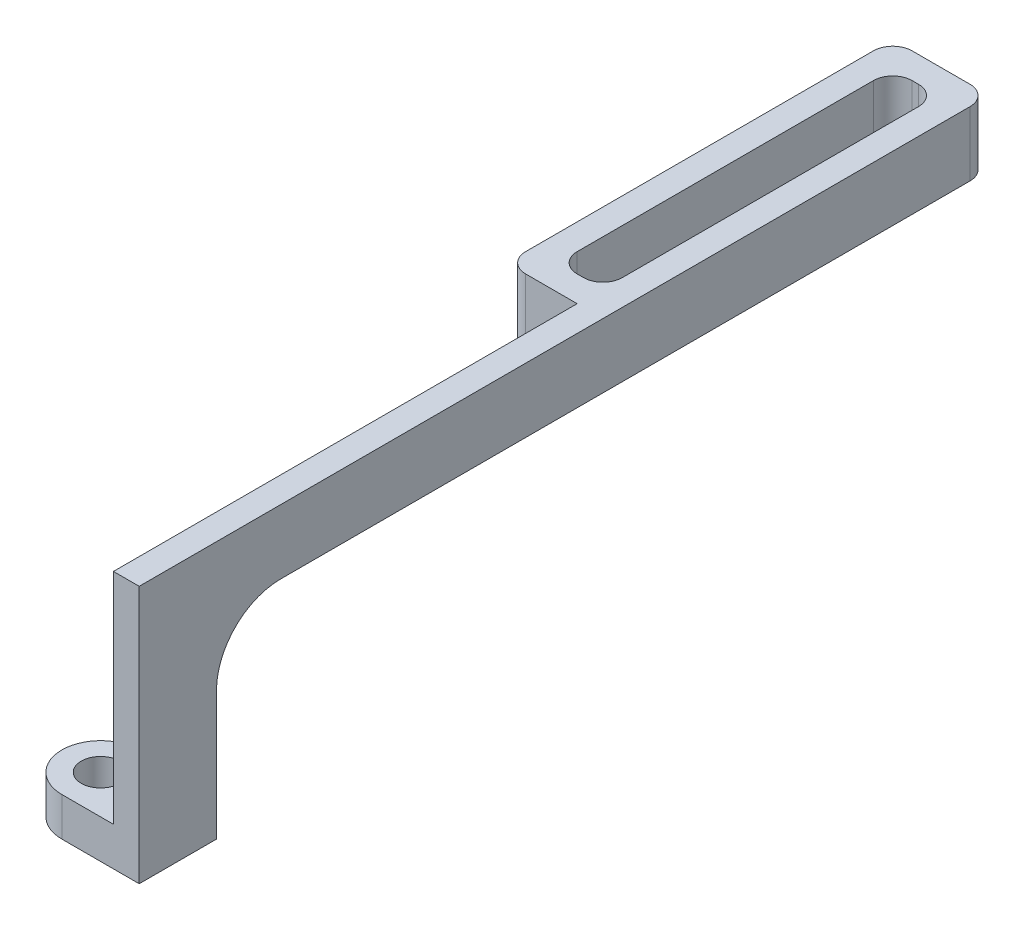
ISO-10303-21;
HEADER;
FILE_DESCRIPTION(('STEP AP214'),'2;1');
FILE_NAME('part.step','',(''),(''),'','','');
FILE_SCHEMA(('AUTOMOTIVE_DESIGN { 1 0 10303 214 1 1 1 1 }'));
ENDSEC;
DATA;
#1=APPLICATION_CONTEXT('core data for automotive mechanical design processes');
#2=APPLICATION_PROTOCOL_DEFINITION('international standard','automotive_design',2000,#1);
#3=PRODUCT_CONTEXT('',#1,'mechanical');
#4=PRODUCT('Part','Part','',(#3));
#5=PRODUCT_RELATED_PRODUCT_CATEGORY('part','',(#4));
#6=PRODUCT_DEFINITION_FORMATION('','',#4);
#7=PRODUCT_DEFINITION_CONTEXT('part definition',#1,'design');
#8=PRODUCT_DEFINITION('design','',#6,#7);
#9=PRODUCT_DEFINITION_SHAPE('','',#8);
#10=(LENGTH_UNIT() NAMED_UNIT(*) SI_UNIT(.MILLI.,.METRE.));
#11=(NAMED_UNIT(*) PLANE_ANGLE_UNIT() SI_UNIT($,.RADIAN.));
#12=(NAMED_UNIT(*) SI_UNIT($,.STERADIAN.) SOLID_ANGLE_UNIT());
#13=UNCERTAINTY_MEASURE_WITH_UNIT(LENGTH_MEASURE(1.E-05),#10,'distance_accuracy_value','');
#14=(GEOMETRIC_REPRESENTATION_CONTEXT(3) GLOBAL_UNCERTAINTY_ASSIGNED_CONTEXT((#13)) GLOBAL_UNIT_ASSIGNED_CONTEXT((#10,
#11,#12)) REPRESENTATION_CONTEXT('',''));
#15=CARTESIAN_POINT('',(0.,0.,0.));
#16=DIRECTION('',(0.,0.,1.));
#17=DIRECTION('',(1.,0.,0.));
#18=AXIS2_PLACEMENT_3D('',#15,#16,#17);
#19=CARTESIAN_POINT('',(0.,3.,0.));
#20=DIRECTION('',(0.,1.,0.));
#21=DIRECTION('',(0.,0.,1.));
#22=AXIS2_PLACEMENT_3D('',#19,#20,#21);
#23=PLANE('',#22);
#24=CARTESIAN_POINT('',(0.,3.,0.));
#25=DIRECTION('',(0.,1.,0.));
#26=DIRECTION('',(0.,0.,1.));
#27=AXIS2_PLACEMENT_3D('',#24,#25,#26);
#28=CIRCLE('',#27,1.5);
#29=CARTESIAN_POINT('',(0.,3.,1.5));
#30=VERTEX_POINT('',#29);
#31=EDGE_CURVE('E279',#30,#30,#28,.T.);
#32=ORIENTED_EDGE('',*,*,#31,.F.);
#33=EDGE_LOOP('',(#32));
#34=FACE_BOUND('',#33,.T.);
#35=DIRECTION('',(1.,0.,0.));
#36=VECTOR('',#35,1.);
#37=CARTESIAN_POINT('',(0.,3.,3.));
#38=LINE('',#37,#36);
#39=CARTESIAN_POINT('',(0.,3.,3.));
#40=VERTEX_POINT('',#39);
#41=CARTESIAN_POINT('',(4.,3.,3.));
#42=VERTEX_POINT('',#41);
#43=EDGE_CURVE('E288',#40,#42,#38,.T.);
#44=ORIENTED_EDGE('',*,*,#43,.T.);
#45=DIRECTION('',(0.,0.,-1.));
#46=VECTOR('',#45,1.);
#47=CARTESIAN_POINT('',(4.,3.,0.));
#48=LINE('',#47,#46);
#49=CARTESIAN_POINT('',(4.,3.,-3.));
#50=VERTEX_POINT('',#49);
#51=EDGE_CURVE('E274',#42,#50,#48,.T.);
#52=ORIENTED_EDGE('',*,*,#51,.T.);
#53=DIRECTION('',(1.,0.,0.));
#54=VECTOR('',#53,1.);
#55=CARTESIAN_POINT('',(0.,3.,-3.));
#56=LINE('',#55,#54);
#57=CARTESIAN_POINT('',(0.,3.,-3.));
#58=VERTEX_POINT('',#57);
#59=EDGE_CURVE('E292',#58,#50,#56,.T.);
#60=ORIENTED_EDGE('',*,*,#59,.F.);
#61=CARTESIAN_POINT('',(0.,3.,0.));
#62=DIRECTION('',(0.,1.,0.));
#63=DIRECTION('',(0.,0.,1.));
#64=AXIS2_PLACEMENT_3D('',#61,#62,#63);
#65=CIRCLE('',#64,3.);
#66=EDGE_CURVE('E283',#58,#40,#65,.T.);
#67=ORIENTED_EDGE('',*,*,#66,.T.);
#68=EDGE_LOOP('',(#44,#52,#60,#67));
#69=FACE_BOUND('',#68,.T.);
#70=ADVANCED_FACE('F47',(#34,#69),#23,.T.);
#71=CARTESIAN_POINT('',(0.,3.,0.));
#72=DIRECTION('',(0.,-1.,0.));
#73=DIRECTION('',(0.,0.,-1.));
#74=AXIS2_PLACEMENT_3D('',#71,#72,#73);
#75=CYLINDRICAL_SURFACE('',#74,3.);
#76=CARTESIAN_POINT('',(0.,0.,0.));
#77=DIRECTION('',(0.,1.,0.));
#78=DIRECTION('',(0.,0.,1.));
#79=AXIS2_PLACEMENT_3D('',#76,#77,#78);
#80=CIRCLE('',#79,3.);
#81=CARTESIAN_POINT('',(0.,0.,-3.));
#82=VERTEX_POINT('',#81);
#83=CARTESIAN_POINT('',(0.,0.,3.));
#84=VERTEX_POINT('',#83);
#85=EDGE_CURVE('E300',#82,#84,#80,.T.);
#86=ORIENTED_EDGE('',*,*,#85,.T.);
#87=DIRECTION('',(0.,-1.,0.));
#88=VECTOR('',#87,1.);
#89=CARTESIAN_POINT('',(0.,3.,3.));
#90=LINE('',#89,#88);
#91=EDGE_CURVE('E209',#40,#84,#90,.T.);
#92=ORIENTED_EDGE('',*,*,#91,.F.);
#93=ORIENTED_EDGE('',*,*,#66,.F.);
#94=DIRECTION('',(0.,-1.,0.));
#95=VECTOR('',#94,1.);
#96=CARTESIAN_POINT('',(0.,3.,-3.));
#97=LINE('',#96,#95);
#98=EDGE_CURVE('E296',#58,#82,#97,.T.);
#99=ORIENTED_EDGE('',*,*,#98,.T.);
#100=EDGE_LOOP('',(#86,#92,#93,#99));
#101=FACE_BOUND('',#100,.T.);
#102=ADVANCED_FACE('F483',(#101),#75,.T.);
#103=CARTESIAN_POINT('',(0.,3.,3.));
#104=DIRECTION('',(0.,0.,-1.));
#105=DIRECTION('',(-1.,0.,0.));
#106=AXIS2_PLACEMENT_3D('',#103,#104,#105);
#107=PLANE('',#106);
#108=DIRECTION('',(0.,-1.,0.));
#109=VECTOR('',#108,1.);
#110=CARTESIAN_POINT('',(6.,3.,3.));
#111=LINE('',#110,#109);
#112=CARTESIAN_POINT('',(6.,20.,3.));
#113=VERTEX_POINT('',#112);
#114=CARTESIAN_POINT('',(6.,0.,3.));
#115=VERTEX_POINT('',#114);
#116=EDGE_CURVE('E197',#113,#115,#111,.T.);
#117=ORIENTED_EDGE('',*,*,#116,.F.);
#118=DIRECTION('',(1.,0.,0.));
#119=VECTOR('',#118,1.);
#120=CARTESIAN_POINT('',(6.,20.,3.));
#121=LINE('',#120,#119);
#122=CARTESIAN_POINT('',(4.,20.,3.));
#123=VERTEX_POINT('',#122);
#124=EDGE_CURVE('E202',#123,#113,#121,.T.);
#125=ORIENTED_EDGE('',*,*,#124,.F.);
#126=DIRECTION('',(0.,-1.,0.));
#127=VECTOR('',#126,1.);
#128=CARTESIAN_POINT('',(4.,15.,3.));
#129=LINE('',#128,#127);
#130=EDGE_CURVE('E271',#123,#42,#129,.T.);
#131=ORIENTED_EDGE('',*,*,#130,.T.);
#132=ORIENTED_EDGE('',*,*,#43,.F.);
#133=ORIENTED_EDGE('',*,*,#91,.T.);
#134=DIRECTION('',(1.,0.,0.));
#135=VECTOR('',#134,1.);
#136=CARTESIAN_POINT('',(0.,0.,3.));
#137=LINE('',#136,#135);
#138=EDGE_CURVE('E204',#84,#115,#137,.T.);
#139=ORIENTED_EDGE('',*,*,#138,.T.);
#140=EDGE_LOOP('',(#117,#125,#131,#132,#133,#139));
#141=FACE_BOUND('',#140,.T.);
#142=ADVANCED_FACE('F199',(#141),#107,.F.);
#143=CARTESIAN_POINT('',(6.,3.,0.));
#144=DIRECTION('',(-1.,0.,0.));
#145=DIRECTION('',(0.,0.,1.));
#146=AXIS2_PLACEMENT_3D('',#143,#144,#145);
#147=PLANE('',#146);
#148=DIRECTION('',(0.,0.,-1.));
#149=VECTOR('',#148,1.);
#150=CARTESIAN_POINT('',(6.,15.,3.));
#151=LINE('',#150,#149);
#152=CARTESIAN_POINT('',(6.,15.,-8.));
#153=VERTEX_POINT('',#152);
#154=CARTESIAN_POINT('',(6.,15.,-61.5));
#155=VERTEX_POINT('',#154);
#156=EDGE_CURVE('E251',#153,#155,#151,.T.);
#157=ORIENTED_EDGE('',*,*,#156,.T.);
#158=DIRECTION('',(0.,-1.,0.));
#159=VECTOR('',#158,1.);
#160=CARTESIAN_POINT('',(6.,3.,-61.5));
#161=LINE('',#160,#159);
#162=CARTESIAN_POINT('',(6.,20.,-61.5));
#163=VERTEX_POINT('',#162);
#164=EDGE_CURVE('E217',#155,#163,#161,.F.);
#165=ORIENTED_EDGE('',*,*,#164,.T.);
#166=DIRECTION('',(0.,0.,-1.));
#167=VECTOR('',#166,1.);
#168=CARTESIAN_POINT('',(6.,20.,3.));
#169=LINE('',#168,#167);
#170=EDGE_CURVE('E213',#113,#163,#169,.T.);
#171=ORIENTED_EDGE('',*,*,#170,.F.);
#172=ORIENTED_EDGE('',*,*,#116,.T.);
#173=DIRECTION('',(0.,0.,-1.));
#174=VECTOR('',#173,1.);
#175=CARTESIAN_POINT('',(6.,0.,0.));
#176=LINE('',#175,#174);
#177=CARTESIAN_POINT('',(6.,0.,-3.));
#178=VERTEX_POINT('',#177);
#179=EDGE_CURVE('E306',#115,#178,#176,.T.);
#180=ORIENTED_EDGE('',*,*,#179,.T.);
#181=DIRECTION('',(0.,-1.,0.));
#182=VECTOR('',#181,1.);
#183=CARTESIAN_POINT('',(6.,3.,-3.));
#184=LINE('',#183,#182);
#185=CARTESIAN_POINT('',(6.,10.,-3.));
#186=VERTEX_POINT('',#185);
#187=EDGE_CURVE('E210',#186,#178,#184,.T.);
#188=ORIENTED_EDGE('',*,*,#187,.F.);
#189=CARTESIAN_POINT('',(6.,10.,-8.));
#190=DIRECTION('',(-1.,0.,0.));
#191=DIRECTION('',(0.,0.,1.));
#192=AXIS2_PLACEMENT_3D('',#189,#190,#191);
#193=CIRCLE('',#192,5.);
#194=EDGE_CURVE('E328',#186,#153,#193,.T.);
#195=ORIENTED_EDGE('',*,*,#194,.T.);
#196=EDGE_LOOP('',(#157,#165,#171,#172,#180,#188,#195));
#197=FACE_BOUND('',#196,.T.);
#198=ADVANCED_FACE('F215',(#197),#147,.F.);
#199=CARTESIAN_POINT('',(0.,3.,0.));
#200=DIRECTION('',(0.,-1.,0.));
#201=DIRECTION('',(0.,0.,-1.));
#202=AXIS2_PLACEMENT_3D('',#199,#200,#201);
#203=CYLINDRICAL_SURFACE('',#202,1.5);
#204=ORIENTED_EDGE('',*,*,#31,.T.);
#205=EDGE_LOOP('',(#204));
#206=FACE_BOUND('',#205,.T.);
#207=CARTESIAN_POINT('',(0.,0.,0.));
#208=DIRECTION('',(0.,1.,0.));
#209=DIRECTION('',(0.,0.,1.));
#210=AXIS2_PLACEMENT_3D('',#207,#208,#209);
#211=CIRCLE('',#210,1.5);
#212=CARTESIAN_POINT('',(0.,0.,1.5));
#213=VERTEX_POINT('',#212);
#214=EDGE_CURVE('E278',#213,#213,#211,.T.);
#215=ORIENTED_EDGE('',*,*,#214,.F.);
#216=EDGE_LOOP('',(#215));
#217=FACE_BOUND('',#216,.T.);
#218=ADVANCED_FACE('F505',(#206,#217),#203,.F.);
#219=CARTESIAN_POINT('',(0.,3.,-3.));
#220=DIRECTION('',(0.,0.,-1.));
#221=DIRECTION('',(-1.,0.,0.));
#222=AXIS2_PLACEMENT_3D('',#219,#220,#221);
#223=PLANE('',#222);
#224=DIRECTION('',(0.,-1.,0.));
#225=VECTOR('',#224,1.);
#226=CARTESIAN_POINT('',(4.,15.,-3.));
#227=LINE('',#226,#225);
#228=CARTESIAN_POINT('',(4.,10.,-3.));
#229=VERTEX_POINT('',#228);
#230=EDGE_CURVE('E268',#229,#50,#227,.T.);
#231=ORIENTED_EDGE('',*,*,#230,.F.);
#232=DIRECTION('',(-1.,0.,0.));
#233=VECTOR('',#232,1.);
#234=CARTESIAN_POINT('',(6.,10.,-3.));
#235=LINE('',#234,#233);
#236=EDGE_CURVE('E322',#229,#186,#235,.F.);
#237=ORIENTED_EDGE('',*,*,#236,.T.);
#238=ORIENTED_EDGE('',*,*,#187,.T.);
#239=DIRECTION('',(1.,0.,0.));
#240=VECTOR('',#239,1.);
#241=CARTESIAN_POINT('',(0.,0.,-3.));
#242=LINE('',#241,#240);
#243=EDGE_CURVE('E284',#82,#178,#242,.T.);
#244=ORIENTED_EDGE('',*,*,#243,.F.);
#245=ORIENTED_EDGE('',*,*,#98,.F.);
#246=ORIENTED_EDGE('',*,*,#59,.T.);
#247=EDGE_LOOP('',(#231,#237,#238,#244,#245,#246));
#248=FACE_BOUND('',#247,.T.);
#249=ADVANCED_FACE('F501',(#248),#223,.T.);
#250=CARTESIAN_POINT('',(0.,0.,0.));
#251=DIRECTION('',(0.,1.,0.));
#252=DIRECTION('',(0.,0.,1.));
#253=AXIS2_PLACEMENT_3D('',#250,#251,#252);
#254=PLANE('',#253);
#255=ORIENTED_EDGE('',*,*,#179,.F.);
#256=ORIENTED_EDGE('',*,*,#138,.F.);
#257=ORIENTED_EDGE('',*,*,#85,.F.);
#258=ORIENTED_EDGE('',*,*,#243,.T.);
#259=EDGE_LOOP('',(#255,#256,#257,#258));
#260=FACE_BOUND('',#259,.T.);
#261=ORIENTED_EDGE('',*,*,#214,.T.);
#262=EDGE_LOOP('',(#261));
#263=FACE_BOUND('',#262,.T.);
#264=ADVANCED_FACE('F499',(#260,#263),#254,.F.);
#265=CARTESIAN_POINT('',(4.,15.,3.));
#266=DIRECTION('',(1.,0.,0.));
#267=DIRECTION('',(0.,0.,-1.));
#268=AXIS2_PLACEMENT_3D('',#265,#266,#267);
#269=PLANE('',#268);
#270=ORIENTED_EDGE('',*,*,#51,.F.);
#271=ORIENTED_EDGE('',*,*,#130,.F.);
#272=DIRECTION('',(0.,0.,1.));
#273=VECTOR('',#272,1.);
#274=CARTESIAN_POINT('',(4.,20.,3.));
#275=LINE('',#274,#273);
#276=CARTESIAN_POINT('',(4.,20.,-33.));
#277=VERTEX_POINT('',#276);
#278=EDGE_CURVE('E227',#277,#123,#275,.T.);
#279=ORIENTED_EDGE('',*,*,#278,.F.);
#280=DIRECTION('',(0.,-1.,0.));
#281=VECTOR('',#280,1.);
#282=CARTESIAN_POINT('',(4.,20.,-33.));
#283=LINE('',#282,#281);
#284=CARTESIAN_POINT('',(4.,15.,-33.));
#285=VERTEX_POINT('',#284);
#286=EDGE_CURVE('E250',#277,#285,#283,.T.);
#287=ORIENTED_EDGE('',*,*,#286,.T.);
#288=DIRECTION('',(0.,0.,1.));
#289=VECTOR('',#288,1.);
#290=CARTESIAN_POINT('',(4.,15.,3.));
#291=LINE('',#290,#289);
#292=CARTESIAN_POINT('',(4.,15.,-8.));
#293=VERTEX_POINT('',#292);
#294=EDGE_CURVE('E229',#285,#293,#291,.T.);
#295=ORIENTED_EDGE('',*,*,#294,.T.);
#296=CARTESIAN_POINT('',(4.,10.,-8.));
#297=DIRECTION('',(1.,0.,0.));
#298=DIRECTION('',(0.,0.,-1.));
#299=AXIS2_PLACEMENT_3D('',#296,#297,#298);
#300=CIRCLE('',#299,5.);
#301=EDGE_CURVE('E325',#293,#229,#300,.T.);
#302=ORIENTED_EDGE('',*,*,#301,.T.);
#303=ORIENTED_EDGE('',*,*,#230,.T.);
#304=EDGE_LOOP('',(#270,#271,#279,#287,#295,#302,#303));
#305=FACE_BOUND('',#304,.T.);
#306=ADVANCED_FACE('F497',(#305),#269,.F.);
#307=CARTESIAN_POINT('',(0.,20.,0.));
#308=DIRECTION('',(0.,-1.,0.));
#309=DIRECTION('',(0.,0.,-1.));
#310=AXIS2_PLACEMENT_3D('',#307,#308,#309);
#311=PLANE('',#310);
#312=DIRECTION('',(0.,0.,1.));
#313=VECTOR('',#312,1.);
#314=CARTESIAN_POINT('',(-1.5,20.,-63.));
#315=LINE('',#314,#313);
#316=CARTESIAN_POINT('',(-1.5,20.,-61.5));
#317=VERTEX_POINT('',#316);
#318=CARTESIAN_POINT('',(-1.5,20.,-34.5));
#319=VERTEX_POINT('',#318);
#320=EDGE_CURVE('E242',#317,#319,#315,.T.);
#321=ORIENTED_EDGE('',*,*,#320,.T.);
#322=CARTESIAN_POINT('',(0.,20.,-34.5));
#323=DIRECTION('',(0.,-1.,0.));
#324=DIRECTION('',(0.,0.,-1.));
#325=AXIS2_PLACEMENT_3D('',#322,#323,#324);
#326=CIRCLE('',#325,1.5);
#327=CARTESIAN_POINT('',(0.,20.,-33.));
#328=VERTEX_POINT('',#327);
#329=EDGE_CURVE('E357',#319,#328,#326,.F.);
#330=ORIENTED_EDGE('',*,*,#329,.T.);
#331=DIRECTION('',(1.,0.,0.));
#332=VECTOR('',#331,1.);
#333=CARTESIAN_POINT('',(-1.5,20.,-33.));
#334=LINE('',#333,#332);
#335=EDGE_CURVE('E245',#328,#277,#334,.T.);
#336=ORIENTED_EDGE('',*,*,#335,.T.);
#337=ORIENTED_EDGE('',*,*,#278,.T.);
#338=ORIENTED_EDGE('',*,*,#124,.T.);
#339=ORIENTED_EDGE('',*,*,#170,.T.);
#340=CARTESIAN_POINT('',(4.5,20.,-61.5));
#341=DIRECTION('',(0.,-1.,0.));
#342=DIRECTION('',(0.,0.,-1.));
#343=AXIS2_PLACEMENT_3D('',#340,#341,#342);
#344=CIRCLE('',#343,1.5);
#345=CARTESIAN_POINT('',(4.5,20.,-63.));
#346=VERTEX_POINT('',#345);
#347=EDGE_CURVE('E354',#163,#346,#344,.F.);
#348=ORIENTED_EDGE('',*,*,#347,.T.);
#349=DIRECTION('',(-1.,0.,0.));
#350=VECTOR('',#349,1.);
#351=CARTESIAN_POINT('',(4.,20.,-63.));
#352=LINE('',#351,#350);
#353=CARTESIAN_POINT('',(0.,20.,-63.));
#354=VERTEX_POINT('',#353);
#355=EDGE_CURVE('E221',#346,#354,#352,.T.);
#356=ORIENTED_EDGE('',*,*,#355,.T.);
#357=CARTESIAN_POINT('',(0.,20.,-61.5));
#358=DIRECTION('',(0.,-1.,0.));
#359=DIRECTION('',(0.,0.,-1.));
#360=AXIS2_PLACEMENT_3D('',#357,#358,#359);
#361=CIRCLE('',#360,1.5);
#362=EDGE_CURVE('E351',#354,#317,#361,.F.);
#363=ORIENTED_EDGE('',*,*,#362,.T.);
#364=EDGE_LOOP('',(#321,#330,#336,#337,#338,#339,#348,#356,#363));
#365=FACE_BOUND('',#364,.T.);
#366=DIRECTION('',(0.,0.,-1.));
#367=VECTOR('',#366,1.);
#368=CARTESIAN_POINT('',(4.00000000000001,20.,-35.));
#369=LINE('',#368,#367);
#370=CARTESIAN_POINT('',(4.00000000000001,20.,-36.5));
#371=VERTEX_POINT('',#370);
#372=CARTESIAN_POINT('',(3.99999999999999,20.,-59.5));
#373=VERTEX_POINT('',#372);
#374=EDGE_CURVE('E433',#371,#373,#369,.T.);
#375=ORIENTED_EDGE('',*,*,#374,.F.);
#376=CARTESIAN_POINT('',(2.50000000000001,20.,-36.5));
#377=DIRECTION('',(0.,-1.,0.));
#378=DIRECTION('',(0.,0.,-1.));
#379=AXIS2_PLACEMENT_3D('',#376,#377,#378);
#380=CIRCLE('',#379,1.5);
#381=CARTESIAN_POINT('',(2.50000000000001,20.,-35.));
#382=VERTEX_POINT('',#381);
#383=EDGE_CURVE('E386',#371,#382,#380,.T.);
#384=ORIENTED_EDGE('',*,*,#383,.T.);
#385=DIRECTION('',(1.,0.,0.));
#386=VECTOR('',#385,1.);
#387=CARTESIAN_POINT('',(0.500000000000003,20.,-35.));
#388=LINE('',#387,#386);
#389=CARTESIAN_POINT('',(2.,20.,-35.));
#390=VERTEX_POINT('',#389);
#391=EDGE_CURVE('E255',#390,#382,#388,.T.);
#392=ORIENTED_EDGE('',*,*,#391,.F.);
#393=CARTESIAN_POINT('',(2.,20.,-36.5));
#394=DIRECTION('',(0.,-1.,0.));
#395=DIRECTION('',(0.,0.,-1.));
#396=AXIS2_PLACEMENT_3D('',#393,#394,#395);
#397=CIRCLE('',#396,1.5);
#398=CARTESIAN_POINT('',(0.500000000000003,20.,-36.5));
#399=VERTEX_POINT('',#398);
#400=EDGE_CURVE('E392',#390,#399,#397,.T.);
#401=ORIENTED_EDGE('',*,*,#400,.T.);
#402=DIRECTION('',(0.,0.,1.));
#403=VECTOR('',#402,1.);
#404=CARTESIAN_POINT('',(0.499999999999999,20.,-61.));
#405=LINE('',#404,#403);
#406=CARTESIAN_POINT('',(0.499999999999999,20.,-59.5));
#407=VERTEX_POINT('',#406);
#408=EDGE_CURVE('E440',#407,#399,#405,.T.);
#409=ORIENTED_EDGE('',*,*,#408,.F.);
#410=CARTESIAN_POINT('',(2.,20.,-59.5));
#411=DIRECTION('',(0.,-1.,0.));
#412=DIRECTION('',(0.,0.,-1.));
#413=AXIS2_PLACEMENT_3D('',#410,#411,#412);
#414=CIRCLE('',#413,1.5);
#415=CARTESIAN_POINT('',(2.,20.,-61.));
#416=VERTEX_POINT('',#415);
#417=EDGE_CURVE('E412',#407,#416,#414,.T.);
#418=ORIENTED_EDGE('',*,*,#417,.T.);
#419=DIRECTION('',(-1.,0.,0.));
#420=VECTOR('',#419,1.);
#421=CARTESIAN_POINT('',(3.99999999999999,20.,-61.));
#422=LINE('',#421,#420);
#423=CARTESIAN_POINT('',(2.49999999999999,20.,-61.));
#424=VERTEX_POINT('',#423);
#425=EDGE_CURVE('E436',#424,#416,#422,.T.);
#426=ORIENTED_EDGE('',*,*,#425,.F.);
#427=CARTESIAN_POINT('',(2.49999999999999,20.,-59.5));
#428=DIRECTION('',(0.,-1.,0.));
#429=DIRECTION('',(0.,0.,-1.));
#430=AXIS2_PLACEMENT_3D('',#427,#428,#429);
#431=CIRCLE('',#430,1.5);
#432=EDGE_CURVE('E11',#424,#373,#431,.T.);
#433=ORIENTED_EDGE('',*,*,#432,.T.);
#434=EDGE_LOOP('',(#375,#384,#392,#401,#409,#418,#426,#433));
#435=FACE_BOUND('',#434,.T.);
#436=ADVANCED_FACE('F225',(#365,#435),#311,.F.);
#437=CARTESIAN_POINT('',(0.,15.,0.));
#438=DIRECTION('',(0.,-1.,0.));
#439=DIRECTION('',(0.,0.,-1.));
#440=AXIS2_PLACEMENT_3D('',#437,#438,#439);
#441=PLANE('',#440);
#442=DIRECTION('',(1.,0.,0.));
#443=VECTOR('',#442,1.);
#444=CARTESIAN_POINT('',(-1.5,15.,-33.));
#445=LINE('',#444,#443);
#446=CARTESIAN_POINT('',(0.,15.,-33.));
#447=VERTEX_POINT('',#446);
#448=EDGE_CURVE('E233',#447,#285,#445,.T.);
#449=ORIENTED_EDGE('',*,*,#448,.F.);
#450=CARTESIAN_POINT('',(0.,15.,-34.5));
#451=DIRECTION('',(0.,-1.,0.));
#452=DIRECTION('',(0.,0.,-1.));
#453=AXIS2_PLACEMENT_3D('',#450,#451,#452);
#454=CIRCLE('',#453,1.5);
#455=CARTESIAN_POINT('',(-1.5,15.,-34.5));
#456=VERTEX_POINT('',#455);
#457=EDGE_CURVE('E341',#447,#456,#454,.T.);
#458=ORIENTED_EDGE('',*,*,#457,.T.);
#459=DIRECTION('',(0.,0.,1.));
#460=VECTOR('',#459,1.);
#461=CARTESIAN_POINT('',(-1.5,15.,-63.));
#462=LINE('',#461,#460);
#463=CARTESIAN_POINT('',(-1.5,15.,-61.5));
#464=VERTEX_POINT('',#463);
#465=EDGE_CURVE('E259',#464,#456,#462,.T.);
#466=ORIENTED_EDGE('',*,*,#465,.F.);
#467=CARTESIAN_POINT('',(0.,15.,-61.5));
#468=DIRECTION('',(0.,-1.,0.));
#469=DIRECTION('',(0.,0.,-1.));
#470=AXIS2_PLACEMENT_3D('',#467,#468,#469);
#471=CIRCLE('',#470,1.5);
#472=CARTESIAN_POINT('',(0.,15.,-63.));
#473=VERTEX_POINT('',#472);
#474=EDGE_CURVE('E335',#464,#473,#471,.T.);
#475=ORIENTED_EDGE('',*,*,#474,.T.);
#476=DIRECTION('',(-1.,0.,0.));
#477=VECTOR('',#476,1.);
#478=CARTESIAN_POINT('',(4.,15.,-63.));
#479=LINE('',#478,#477);
#480=CARTESIAN_POINT('',(4.5,15.,-63.));
#481=VERTEX_POINT('',#480);
#482=EDGE_CURVE('E254',#481,#473,#479,.T.);
#483=ORIENTED_EDGE('',*,*,#482,.F.);
#484=CARTESIAN_POINT('',(4.5,15.,-61.5));
#485=DIRECTION('',(0.,-1.,0.));
#486=DIRECTION('',(0.,0.,-1.));
#487=AXIS2_PLACEMENT_3D('',#484,#485,#486);
#488=CIRCLE('',#487,1.5);
#489=EDGE_CURVE('E338',#481,#155,#488,.T.);
#490=ORIENTED_EDGE('',*,*,#489,.T.);
#491=ORIENTED_EDGE('',*,*,#156,.F.);
#492=DIRECTION('',(-1.,0.,0.));
#493=VECTOR('',#492,1.);
#494=CARTESIAN_POINT('',(4.,15.,-8.));
#495=LINE('',#494,#493);
#496=EDGE_CURVE('E318',#153,#293,#495,.T.);
#497=ORIENTED_EDGE('',*,*,#496,.T.);
#498=ORIENTED_EDGE('',*,*,#294,.F.);
#499=EDGE_LOOP('',(#449,#458,#466,#475,#483,#490,#491,#497,#498));
#500=FACE_BOUND('',#499,.T.);
#501=DIRECTION('',(-1.,0.,0.));
#502=VECTOR('',#501,1.);
#503=CARTESIAN_POINT('',(3.99999999999999,15.,-61.));
#504=LINE('',#503,#502);
#505=CARTESIAN_POINT('',(2.49999999999999,15.,-61.));
#506=VERTEX_POINT('',#505);
#507=CARTESIAN_POINT('',(2.,15.,-61.));
#508=VERTEX_POINT('',#507);
#509=EDGE_CURVE('E420',#506,#508,#504,.T.);
#510=ORIENTED_EDGE('',*,*,#509,.T.);
#511=CARTESIAN_POINT('',(2.,15.,-59.5));
#512=DIRECTION('',(0.,-1.,0.));
#513=DIRECTION('',(0.,0.,-1.));
#514=AXIS2_PLACEMENT_3D('',#511,#512,#513);
#515=CIRCLE('',#514,1.5);
#516=CARTESIAN_POINT('',(0.499999999999999,15.,-59.5));
#517=VERTEX_POINT('',#516);
#518=EDGE_CURVE('E409',#508,#517,#515,.F.);
#519=ORIENTED_EDGE('',*,*,#518,.T.);
#520=DIRECTION('',(0.,0.,1.));
#521=VECTOR('',#520,1.);
#522=CARTESIAN_POINT('',(0.499999999999999,15.,-61.));
#523=LINE('',#522,#521);
#524=CARTESIAN_POINT('',(0.500000000000003,15.,-36.5));
#525=VERTEX_POINT('',#524);
#526=EDGE_CURVE('E428',#517,#525,#523,.T.);
#527=ORIENTED_EDGE('',*,*,#526,.T.);
#528=CARTESIAN_POINT('',(2.,15.,-36.5));
#529=DIRECTION('',(0.,-1.,0.));
#530=DIRECTION('',(0.,0.,-1.));
#531=AXIS2_PLACEMENT_3D('',#528,#529,#530);
#532=CIRCLE('',#531,1.5);
#533=CARTESIAN_POINT('',(2.,15.,-35.));
#534=VERTEX_POINT('',#533);
#535=EDGE_CURVE('E389',#525,#534,#532,.F.);
#536=ORIENTED_EDGE('',*,*,#535,.T.);
#537=DIRECTION('',(1.,0.,0.));
#538=VECTOR('',#537,1.);
#539=CARTESIAN_POINT('',(0.500000000000003,15.,-35.));
#540=LINE('',#539,#538);
#541=CARTESIAN_POINT('',(2.50000000000001,15.,-35.));
#542=VERTEX_POINT('',#541);
#543=EDGE_CURVE('E236',#534,#542,#540,.T.);
#544=ORIENTED_EDGE('',*,*,#543,.T.);
#545=CARTESIAN_POINT('',(2.50000000000001,15.,-36.5));
#546=DIRECTION('',(0.,-1.,0.));
#547=DIRECTION('',(0.,0.,-1.));
#548=AXIS2_PLACEMENT_3D('',#545,#546,#547);
#549=CIRCLE('',#548,1.5);
#550=CARTESIAN_POINT('',(4.00000000000001,15.,-36.5));
#551=VERTEX_POINT('',#550);
#552=EDGE_CURVE('E383',#542,#551,#549,.F.);
#553=ORIENTED_EDGE('',*,*,#552,.T.);
#554=DIRECTION('',(0.,0.,-1.));
#555=VECTOR('',#554,1.);
#556=CARTESIAN_POINT('',(4.00000000000001,15.,-35.));
#557=LINE('',#556,#555);
#558=CARTESIAN_POINT('',(3.99999999999999,15.,-59.5));
#559=VERTEX_POINT('',#558);
#560=EDGE_CURVE('E422',#551,#559,#557,.T.);
#561=ORIENTED_EDGE('',*,*,#560,.T.);
#562=CARTESIAN_POINT('',(2.49999999999999,15.,-59.5));
#563=DIRECTION('',(0.,-1.,0.));
#564=DIRECTION('',(0.,0.,-1.));
#565=AXIS2_PLACEMENT_3D('',#562,#563,#564);
#566=CIRCLE('',#565,1.5);
#567=EDGE_CURVE('E56',#559,#506,#566,.F.);
#568=ORIENTED_EDGE('',*,*,#567,.T.);
#569=EDGE_LOOP('',(#510,#519,#527,#536,#544,#553,#561,#568));
#570=FACE_BOUND('',#569,.T.);
#571=ADVANCED_FACE('F419',(#500,#570),#441,.T.);
#572=CARTESIAN_POINT('',(4.,20.,-63.));
#573=DIRECTION('',(0.,0.,1.));
#574=DIRECTION('',(1.,0.,0.));
#575=AXIS2_PLACEMENT_3D('',#572,#573,#574);
#576=PLANE('',#575);
#577=ORIENTED_EDGE('',*,*,#355,.F.);
#578=DIRECTION('',(0.,-1.,0.));
#579=VECTOR('',#578,1.);
#580=CARTESIAN_POINT('',(4.5,20.,-63.));
#581=LINE('',#580,#579);
#582=EDGE_CURVE('E363',#346,#481,#581,.T.);
#583=ORIENTED_EDGE('',*,*,#582,.T.);
#584=ORIENTED_EDGE('',*,*,#482,.T.);
#585=DIRECTION('',(0.,-1.,0.));
#586=VECTOR('',#585,1.);
#587=CARTESIAN_POINT('',(0.,20.,-63.));
#588=LINE('',#587,#586);
#589=EDGE_CURVE('E360',#473,#354,#588,.F.);
#590=ORIENTED_EDGE('',*,*,#589,.T.);
#591=EDGE_LOOP('',(#577,#583,#584,#590));
#592=FACE_BOUND('',#591,.T.);
#593=ADVANCED_FACE('F529',(#592),#576,.F.);
#594=CARTESIAN_POINT('',(-1.5,20.,-63.));
#595=DIRECTION('',(1.,0.,0.));
#596=DIRECTION('',(0.,0.,-1.));
#597=AXIS2_PLACEMENT_3D('',#594,#595,#596);
#598=PLANE('',#597);
#599=ORIENTED_EDGE('',*,*,#465,.T.);
#600=DIRECTION('',(0.,-1.,0.));
#601=VECTOR('',#600,1.);
#602=CARTESIAN_POINT('',(-1.5,20.,-34.5));
#603=LINE('',#602,#601);
#604=EDGE_CURVE('E348',#456,#319,#603,.F.);
#605=ORIENTED_EDGE('',*,*,#604,.T.);
#606=ORIENTED_EDGE('',*,*,#320,.F.);
#607=DIRECTION('',(0.,-1.,0.));
#608=VECTOR('',#607,1.);
#609=CARTESIAN_POINT('',(-1.5,20.,-61.5));
#610=LINE('',#609,#608);
#611=EDGE_CURVE('E344',#317,#464,#610,.T.);
#612=ORIENTED_EDGE('',*,*,#611,.T.);
#613=EDGE_LOOP('',(#599,#605,#606,#612));
#614=FACE_BOUND('',#613,.T.);
#615=ADVANCED_FACE('F536',(#614),#598,.F.);
#616=CARTESIAN_POINT('',(-1.5,20.,-33.));
#617=DIRECTION('',(0.,0.,-1.));
#618=DIRECTION('',(-1.,0.,0.));
#619=AXIS2_PLACEMENT_3D('',#616,#617,#618);
#620=PLANE('',#619);
#621=ORIENTED_EDGE('',*,*,#335,.F.);
#622=DIRECTION('',(0.,-1.,0.));
#623=VECTOR('',#622,1.);
#624=CARTESIAN_POINT('',(0.,20.,-33.));
#625=LINE('',#624,#623);
#626=EDGE_CURVE('E331',#328,#447,#625,.T.);
#627=ORIENTED_EDGE('',*,*,#626,.T.);
#628=ORIENTED_EDGE('',*,*,#448,.T.);
#629=ORIENTED_EDGE('',*,*,#286,.F.);
#630=EDGE_LOOP('',(#621,#627,#628,#629));
#631=FACE_BOUND('',#630,.T.);
#632=ADVANCED_FACE('F543',(#631),#620,.F.);
#633=CARTESIAN_POINT('',(4.00000000000001,20.,-35.));
#634=DIRECTION('',(-1.,0.,0.));
#635=DIRECTION('',(0.,0.,1.));
#636=AXIS2_PLACEMENT_3D('',#633,#634,#635);
#637=PLANE('',#636);
#638=ORIENTED_EDGE('',*,*,#374,.T.);
#639=DIRECTION('',(0.,-1.,0.));
#640=VECTOR('',#639,1.);
#641=CARTESIAN_POINT('',(3.99999999999999,15.,-59.5));
#642=LINE('',#641,#640);
#643=EDGE_CURVE('E406',#373,#559,#642,.T.);
#644=ORIENTED_EDGE('',*,*,#643,.T.);
#645=ORIENTED_EDGE('',*,*,#560,.F.);
#646=DIRECTION('',(0.,-1.,0.));
#647=VECTOR('',#646,1.);
#648=CARTESIAN_POINT('',(4.00000000000001,20.,-36.5));
#649=LINE('',#648,#647);
#650=EDGE_CURVE('E376',#551,#371,#649,.F.);
#651=ORIENTED_EDGE('',*,*,#650,.T.);
#652=EDGE_LOOP('',(#638,#644,#645,#651));
#653=FACE_BOUND('',#652,.T.);
#654=ADVANCED_FACE('F431',(#653),#637,.T.);
#655=CARTESIAN_POINT('',(3.99999999999999,20.,-61.));
#656=DIRECTION('',(0.,0.,1.));
#657=DIRECTION('',(1.,0.,0.));
#658=AXIS2_PLACEMENT_3D('',#655,#656,#657);
#659=PLANE('',#658);
#660=ORIENTED_EDGE('',*,*,#425,.T.);
#661=DIRECTION('',(0.,-1.,0.));
#662=VECTOR('',#661,1.);
#663=CARTESIAN_POINT('',(2.,15.,-61.));
#664=LINE('',#663,#662);
#665=EDGE_CURVE('E399',#416,#508,#664,.T.);
#666=ORIENTED_EDGE('',*,*,#665,.T.);
#667=ORIENTED_EDGE('',*,*,#509,.F.);
#668=DIRECTION('',(0.,-1.,0.));
#669=VECTOR('',#668,1.);
#670=CARTESIAN_POINT('',(2.49999999999999,20.,-61.));
#671=LINE('',#670,#669);
#672=EDGE_CURVE('E396',#506,#424,#671,.F.);
#673=ORIENTED_EDGE('',*,*,#672,.T.);
#674=EDGE_LOOP('',(#660,#666,#667,#673));
#675=FACE_BOUND('',#674,.T.);
#676=ADVANCED_FACE('F425',(#675),#659,.T.);
#677=CARTESIAN_POINT('',(0.499999999999999,20.,-61.));
#678=DIRECTION('',(1.,0.,0.));
#679=DIRECTION('',(0.,0.,-1.));
#680=AXIS2_PLACEMENT_3D('',#677,#678,#679);
#681=PLANE('',#680);
#682=ORIENTED_EDGE('',*,*,#526,.F.);
#683=DIRECTION('',(0.,-1.,0.));
#684=VECTOR('',#683,1.);
#685=CARTESIAN_POINT('',(0.499999999999999,20.,-59.5));
#686=LINE('',#685,#684);
#687=EDGE_CURVE('E403',#517,#407,#686,.F.);
#688=ORIENTED_EDGE('',*,*,#687,.T.);
#689=ORIENTED_EDGE('',*,*,#408,.T.);
#690=DIRECTION('',(0.,-1.,0.));
#691=VECTOR('',#690,1.);
#692=CARTESIAN_POINT('',(0.500000000000003,15.,-36.5));
#693=LINE('',#692,#691);
#694=EDGE_CURVE('E379',#399,#525,#693,.T.);
#695=ORIENTED_EDGE('',*,*,#694,.T.);
#696=EDGE_LOOP('',(#682,#688,#689,#695));
#697=FACE_BOUND('',#696,.T.);
#698=ADVANCED_FACE('F461',(#697),#681,.T.);
#699=CARTESIAN_POINT('',(0.500000000000003,20.,-35.));
#700=DIRECTION('',(0.,0.,-1.));
#701=DIRECTION('',(-1.,0.,0.));
#702=AXIS2_PLACEMENT_3D('',#699,#700,#701);
#703=PLANE('',#702);
#704=ORIENTED_EDGE('',*,*,#391,.T.);
#705=DIRECTION('',(0.,-1.,0.));
#706=VECTOR('',#705,1.);
#707=CARTESIAN_POINT('',(2.50000000000001,15.,-35.));
#708=LINE('',#707,#706);
#709=EDGE_CURVE('E372',#382,#542,#708,.T.);
#710=ORIENTED_EDGE('',*,*,#709,.T.);
#711=ORIENTED_EDGE('',*,*,#543,.F.);
#712=DIRECTION('',(0.,-1.,0.));
#713=VECTOR('',#712,1.);
#714=CARTESIAN_POINT('',(2.,20.,-35.));
#715=LINE('',#714,#713);
#716=EDGE_CURVE('E369',#534,#390,#715,.F.);
#717=ORIENTED_EDGE('',*,*,#716,.T.);
#718=EDGE_LOOP('',(#704,#710,#711,#717));
#719=FACE_BOUND('',#718,.T.);
#720=ADVANCED_FACE('F467',(#719),#703,.T.);
#721=CARTESIAN_POINT('',(0.,10.,-8.));
#722=DIRECTION('',(1.,0.,0.));
#723=DIRECTION('',(0.,0.,-1.));
#724=AXIS2_PLACEMENT_3D('',#721,#722,#723);
#725=CYLINDRICAL_SURFACE('',#724,5.);
#726=ORIENTED_EDGE('',*,*,#194,.F.);
#727=ORIENTED_EDGE('',*,*,#236,.F.);
#728=ORIENTED_EDGE('',*,*,#301,.F.);
#729=ORIENTED_EDGE('',*,*,#496,.F.);
#730=EDGE_LOOP('',(#726,#727,#728,#729));
#731=FACE_BOUND('',#730,.T.);
#732=ADVANCED_FACE('F513',(#731),#725,.F.);
#733=CARTESIAN_POINT('',(0.,20.,-34.5));
#734=DIRECTION('',(0.,-1.,0.));
#735=DIRECTION('',(0.,0.,-1.));
#736=AXIS2_PLACEMENT_3D('',#733,#734,#735);
#737=CYLINDRICAL_SURFACE('',#736,1.5);
#738=ORIENTED_EDGE('',*,*,#329,.F.);
#739=ORIENTED_EDGE('',*,*,#604,.F.);
#740=ORIENTED_EDGE('',*,*,#457,.F.);
#741=ORIENTED_EDGE('',*,*,#626,.F.);
#742=EDGE_LOOP('',(#738,#739,#740,#741));
#743=FACE_BOUND('',#742,.T.);
#744=ADVANCED_FACE('F516',(#743),#737,.T.);
#745=CARTESIAN_POINT('',(4.5,20.,-61.5));
#746=DIRECTION('',(0.,-1.,0.));
#747=DIRECTION('',(0.,0.,-1.));
#748=AXIS2_PLACEMENT_3D('',#745,#746,#747);
#749=CYLINDRICAL_SURFACE('',#748,1.5);
#750=ORIENTED_EDGE('',*,*,#347,.F.);
#751=ORIENTED_EDGE('',*,*,#164,.F.);
#752=ORIENTED_EDGE('',*,*,#489,.F.);
#753=ORIENTED_EDGE('',*,*,#582,.F.);
#754=EDGE_LOOP('',(#750,#751,#752,#753));
#755=FACE_BOUND('',#754,.T.);
#756=ADVANCED_FACE('F479',(#755),#749,.T.);
#757=CARTESIAN_POINT('',(0.,20.,-61.5));
#758=DIRECTION('',(0.,-1.,0.));
#759=DIRECTION('',(0.,0.,-1.));
#760=AXIS2_PLACEMENT_3D('',#757,#758,#759);
#761=CYLINDRICAL_SURFACE('',#760,1.5);
#762=ORIENTED_EDGE('',*,*,#362,.F.);
#763=ORIENTED_EDGE('',*,*,#589,.F.);
#764=ORIENTED_EDGE('',*,*,#474,.F.);
#765=ORIENTED_EDGE('',*,*,#611,.F.);
#766=EDGE_LOOP('',(#762,#763,#764,#765));
#767=FACE_BOUND('',#766,.T.);
#768=ADVANCED_FACE('F471',(#767),#761,.T.);
#769=CARTESIAN_POINT('',(2.50000000000001,20.,-36.5));
#770=DIRECTION('',(0.,1.,0.));
#771=DIRECTION('',(0.,0.,1.));
#772=AXIS2_PLACEMENT_3D('',#769,#770,#771);
#773=CYLINDRICAL_SURFACE('',#772,1.5);
#774=ORIENTED_EDGE('',*,*,#383,.F.);
#775=ORIENTED_EDGE('',*,*,#650,.F.);
#776=ORIENTED_EDGE('',*,*,#552,.F.);
#777=ORIENTED_EDGE('',*,*,#709,.F.);
#778=EDGE_LOOP('',(#774,#775,#776,#777));
#779=FACE_BOUND('',#778,.T.);
#780=ADVANCED_FACE('F469',(#779),#773,.F.);
#781=CARTESIAN_POINT('',(2.,20.,-36.5));
#782=DIRECTION('',(0.,1.,0.));
#783=DIRECTION('',(0.,0.,1.));
#784=AXIS2_PLACEMENT_3D('',#781,#782,#783);
#785=CYLINDRICAL_SURFACE('',#784,1.5);
#786=ORIENTED_EDGE('',*,*,#400,.F.);
#787=ORIENTED_EDGE('',*,*,#716,.F.);
#788=ORIENTED_EDGE('',*,*,#535,.F.);
#789=ORIENTED_EDGE('',*,*,#694,.F.);
#790=EDGE_LOOP('',(#786,#787,#788,#789));
#791=FACE_BOUND('',#790,.T.);
#792=ADVANCED_FACE('F460',(#791),#785,.F.);
#793=CARTESIAN_POINT('',(2.,20.,-59.5));
#794=DIRECTION('',(0.,1.,0.));
#795=DIRECTION('',(0.,0.,1.));
#796=AXIS2_PLACEMENT_3D('',#793,#794,#795);
#797=CYLINDRICAL_SURFACE('',#796,1.5);
#798=ORIENTED_EDGE('',*,*,#417,.F.);
#799=ORIENTED_EDGE('',*,*,#687,.F.);
#800=ORIENTED_EDGE('',*,*,#518,.F.);
#801=ORIENTED_EDGE('',*,*,#665,.F.);
#802=EDGE_LOOP('',(#798,#799,#800,#801));
#803=FACE_BOUND('',#802,.T.);
#804=ADVANCED_FACE('F477',(#803),#797,.F.);
#805=CARTESIAN_POINT('',(2.49999999999999,20.,-59.5));
#806=DIRECTION('',(0.,1.,0.));
#807=DIRECTION('',(0.,0.,1.));
#808=AXIS2_PLACEMENT_3D('',#805,#806,#807);
#809=CYLINDRICAL_SURFACE('',#808,1.5);
#810=ORIENTED_EDGE('',*,*,#432,.F.);
#811=ORIENTED_EDGE('',*,*,#672,.F.);
#812=ORIENTED_EDGE('',*,*,#567,.F.);
#813=ORIENTED_EDGE('',*,*,#643,.F.);
#814=EDGE_LOOP('',(#810,#811,#812,#813));
#815=FACE_BOUND('',#814,.T.);
#816=ADVANCED_FACE('F49',(#815),#809,.F.);
#817=CLOSED_SHELL('',(#70,#102,#142,#198,#218,#249,#264,#306,#436,#571,#593,#615,#632,#654,#676,
#698,#720,#732,#744,#756,#768,#780,#792,#804,#816));
#818=MANIFOLD_SOLID_BREP('B2',#817);
#819=ADVANCED_BREP_SHAPE_REPRESENTATION('',(#18,#818),#14);
#820=SHAPE_DEFINITION_REPRESENTATION(#9,#819);
ENDSEC;
END-ISO-10303-21;
